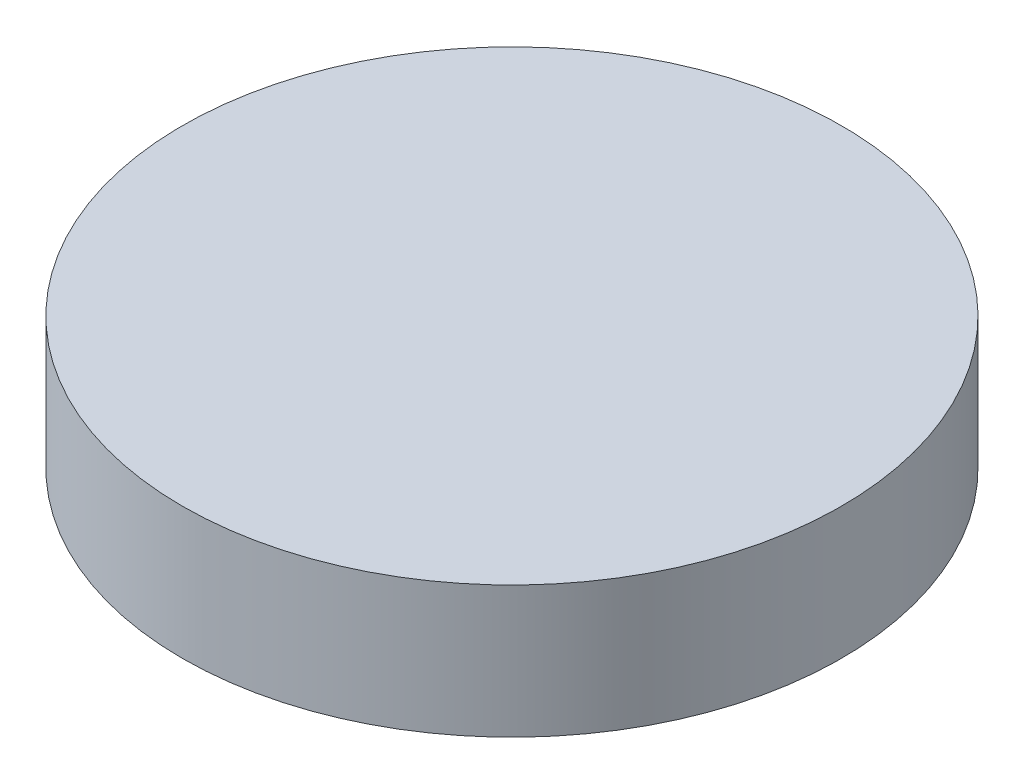
ISO-10303-21;
HEADER;
FILE_DESCRIPTION(('STEP AP214'),'2;1');
FILE_NAME('part.step','',(''),(''),'','','');
FILE_SCHEMA(('AUTOMOTIVE_DESIGN { 1 0 10303 214 1 1 1 1 }'));
ENDSEC;
DATA;
#1=APPLICATION_CONTEXT('core data for automotive mechanical design processes');
#2=APPLICATION_PROTOCOL_DEFINITION('international standard','automotive_design',2000,#1);
#3=PRODUCT_CONTEXT('',#1,'mechanical');
#4=PRODUCT('Part','Part','',(#3));
#5=PRODUCT_RELATED_PRODUCT_CATEGORY('part','',(#4));
#6=PRODUCT_DEFINITION_FORMATION('','',#4);
#7=PRODUCT_DEFINITION_CONTEXT('part definition',#1,'design');
#8=PRODUCT_DEFINITION('design','',#6,#7);
#9=PRODUCT_DEFINITION_SHAPE('','',#8);
#10=(LENGTH_UNIT() NAMED_UNIT(*) SI_UNIT(.MILLI.,.METRE.));
#11=(NAMED_UNIT(*) PLANE_ANGLE_UNIT() SI_UNIT($,.RADIAN.));
#12=(NAMED_UNIT(*) SI_UNIT($,.STERADIAN.) SOLID_ANGLE_UNIT());
#13=UNCERTAINTY_MEASURE_WITH_UNIT(LENGTH_MEASURE(1.E-05),#10,'distance_accuracy_value','');
#14=(GEOMETRIC_REPRESENTATION_CONTEXT(3) GLOBAL_UNCERTAINTY_ASSIGNED_CONTEXT((#13)) GLOBAL_UNIT_ASSIGNED_CONTEXT((#10,
#11,#12)) REPRESENTATION_CONTEXT('',''));
#15=CARTESIAN_POINT('',(0.,0.,0.));
#16=DIRECTION('',(0.,0.,1.));
#17=DIRECTION('',(1.,0.,0.));
#18=AXIS2_PLACEMENT_3D('',#15,#16,#17);
#19=CARTESIAN_POINT('',(0.,4.,0.));
#20=DIRECTION('',(0.,-1.,0.));
#21=DIRECTION('',(0.,0.,-1.));
#22=AXIS2_PLACEMENT_3D('',#19,#20,#21);
#23=CYLINDRICAL_SURFACE('',#22,10.);
#24=CARTESIAN_POINT('',(0.,4.,0.));
#25=DIRECTION('',(0.,1.,0.));
#26=DIRECTION('',(0.,0.,1.));
#27=AXIS2_PLACEMENT_3D('',#24,#25,#26);
#28=CIRCLE('',#27,10.);
#29=CARTESIAN_POINT('',(0.,4.,10.));
#30=VERTEX_POINT('',#29);
#31=EDGE_CURVE('E10',#30,#30,#28,.T.);
#32=ORIENTED_EDGE('',*,*,#31,.F.);
#33=EDGE_LOOP('',(#32));
#34=FACE_BOUND('',#33,.T.);
#35=CARTESIAN_POINT('',(0.,0.,0.));
#36=DIRECTION('',(0.,1.,0.));
#37=DIRECTION('',(0.,0.,1.));
#38=AXIS2_PLACEMENT_3D('',#35,#36,#37);
#39=CIRCLE('',#38,10.);
#40=CARTESIAN_POINT('',(0.,0.,10.));
#41=VERTEX_POINT('',#40);
#42=EDGE_CURVE('E39',#41,#41,#39,.T.);
#43=ORIENTED_EDGE('',*,*,#42,.T.);
#44=EDGE_LOOP('',(#43));
#45=FACE_BOUND('',#44,.T.);
#46=ADVANCED_FACE('F36',(#34,#45),#23,.T.);
#47=CARTESIAN_POINT('',(0.,4.,0.));
#48=DIRECTION('',(0.,1.,0.));
#49=DIRECTION('',(0.,0.,1.));
#50=AXIS2_PLACEMENT_3D('',#47,#48,#49);
#51=PLANE('',#50);
#52=ORIENTED_EDGE('',*,*,#31,.T.);
#53=EDGE_LOOP('',(#52));
#54=FACE_BOUND('',#53,.T.);
#55=ADVANCED_FACE('F51',(#54),#51,.T.);
#56=CARTESIAN_POINT('',(0.,0.,0.));
#57=DIRECTION('',(0.,1.,0.));
#58=DIRECTION('',(0.,0.,1.));
#59=AXIS2_PLACEMENT_3D('',#56,#57,#58);
#60=PLANE('',#59);
#61=ORIENTED_EDGE('',*,*,#42,.F.);
#62=EDGE_LOOP('',(#61));
#63=FACE_BOUND('',#62,.T.);
#64=ADVANCED_FACE('F49',(#63),#60,.F.);
#65=CLOSED_SHELL('',(#46,#55,#64));
#66=MANIFOLD_SOLID_BREP('B2',#65);
#67=ADVANCED_BREP_SHAPE_REPRESENTATION('',(#18,#66),#14);
#68=SHAPE_DEFINITION_REPRESENTATION(#9,#67);
ENDSEC;
END-ISO-10303-21;
